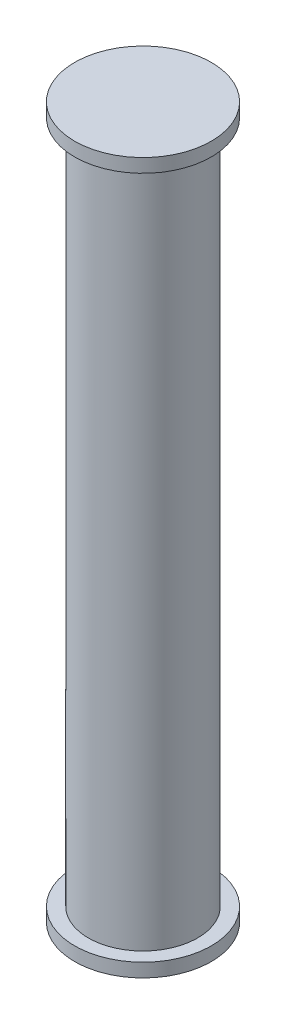
ISO-10303-21;
HEADER;
FILE_DESCRIPTION(('STEP AP214'),'2;1');
FILE_NAME('part.step','',(''),(''),'','','');
FILE_SCHEMA(('AUTOMOTIVE_DESIGN { 1 0 10303 214 1 1 1 1 }'));
ENDSEC;
DATA;
#1=APPLICATION_CONTEXT('core data for automotive mechanical design processes');
#2=APPLICATION_PROTOCOL_DEFINITION('international standard','automotive_design',2000,#1);
#3=PRODUCT_CONTEXT('',#1,'mechanical');
#4=PRODUCT('Part','Part','',(#3));
#5=PRODUCT_RELATED_PRODUCT_CATEGORY('part','',(#4));
#6=PRODUCT_DEFINITION_FORMATION('','',#4);
#7=PRODUCT_DEFINITION_CONTEXT('part definition',#1,'design');
#8=PRODUCT_DEFINITION('design','',#6,#7);
#9=PRODUCT_DEFINITION_SHAPE('','',#8);
#10=(LENGTH_UNIT() NAMED_UNIT(*) SI_UNIT(.MILLI.,.METRE.));
#11=(NAMED_UNIT(*) PLANE_ANGLE_UNIT() SI_UNIT($,.RADIAN.));
#12=(NAMED_UNIT(*) SI_UNIT($,.STERADIAN.) SOLID_ANGLE_UNIT());
#13=UNCERTAINTY_MEASURE_WITH_UNIT(LENGTH_MEASURE(1.E-05),#10,'distance_accuracy_value','');
#14=(GEOMETRIC_REPRESENTATION_CONTEXT(3) GLOBAL_UNCERTAINTY_ASSIGNED_CONTEXT((#13)) GLOBAL_UNIT_ASSIGNED_CONTEXT((#10,
#11,#12)) REPRESENTATION_CONTEXT('',''));
#15=CARTESIAN_POINT('',(0.,0.,0.));
#16=DIRECTION('',(0.,0.,1.));
#17=DIRECTION('',(1.,0.,0.));
#18=AXIS2_PLACEMENT_3D('',#15,#16,#17);
#19=CARTESIAN_POINT('',(0.,66.04,0.));
#20=DIRECTION('',(0.,-1.,0.));
#21=DIRECTION('',(0.,0.,-1.));
#22=AXIS2_PLACEMENT_3D('',#19,#20,#21);
#23=CYLINDRICAL_SURFACE('',#22,10.16);
#24=CARTESIAN_POINT('',(0.,63.5,0.));
#25=DIRECTION('',(0.,1.,0.));
#26=DIRECTION('',(0.,0.,1.));
#27=AXIS2_PLACEMENT_3D('',#24,#25,#26);
#28=CIRCLE('',#27,10.16);
#29=CARTESIAN_POINT('',(0.,63.5,10.16));
#30=VERTEX_POINT('',#29);
#31=EDGE_CURVE('E42',#30,#30,#28,.T.);
#32=ORIENTED_EDGE('',*,*,#31,.F.);
#33=EDGE_LOOP('',(#32));
#34=FACE_BOUND('',#33,.T.);
#35=CARTESIAN_POINT('',(0.,-63.5,0.));
#36=DIRECTION('',(0.,-1.,0.));
#37=DIRECTION('',(0.,0.,-1.));
#38=AXIS2_PLACEMENT_3D('',#35,#36,#37);
#39=CIRCLE('',#38,10.16);
#40=CARTESIAN_POINT('',(0.,-63.5,-10.16));
#41=VERTEX_POINT('',#40);
#42=EDGE_CURVE('E10',#41,#41,#39,.T.);
#43=ORIENTED_EDGE('',*,*,#42,.F.);
#44=EDGE_LOOP('',(#43));
#45=FACE_BOUND('',#44,.T.);
#46=ADVANCED_FACE('F36',(#34,#45),#23,.T.);
#47=CARTESIAN_POINT('',(0.,63.5,0.));
#48=DIRECTION('',(0.,1.,0.));
#49=DIRECTION('',(0.,0.,1.));
#50=AXIS2_PLACEMENT_3D('',#47,#48,#49);
#51=CYLINDRICAL_SURFACE('',#50,12.7);
#52=CARTESIAN_POINT('',(0.,63.5,0.));
#53=DIRECTION('',(0.,1.,0.));
#54=DIRECTION('',(0.,0.,1.));
#55=AXIS2_PLACEMENT_3D('',#52,#53,#54);
#56=CIRCLE('',#55,12.7);
#57=CARTESIAN_POINT('',(0.,63.5,12.7));
#58=VERTEX_POINT('',#57);
#59=EDGE_CURVE('E46',#58,#58,#56,.T.);
#60=ORIENTED_EDGE('',*,*,#59,.T.);
#61=EDGE_LOOP('',(#60));
#62=FACE_BOUND('',#61,.T.);
#63=CARTESIAN_POINT('',(0.,66.04,0.));
#64=DIRECTION('',(0.,1.,0.));
#65=DIRECTION('',(0.,0.,1.));
#66=AXIS2_PLACEMENT_3D('',#63,#64,#65);
#67=CIRCLE('',#66,12.7);
#68=CARTESIAN_POINT('',(0.,66.04,12.7));
#69=VERTEX_POINT('',#68);
#70=EDGE_CURVE('E50',#69,#69,#67,.T.);
#71=ORIENTED_EDGE('',*,*,#70,.F.);
#72=EDGE_LOOP('',(#71));
#73=FACE_BOUND('',#72,.T.);
#74=ADVANCED_FACE('F77',(#62,#73),#51,.T.);
#75=CARTESIAN_POINT('',(0.,63.5,0.));
#76=DIRECTION('',(0.,1.,0.));
#77=DIRECTION('',(0.,0.,1.));
#78=AXIS2_PLACEMENT_3D('',#75,#76,#77);
#79=PLANE('',#78);
#80=ORIENTED_EDGE('',*,*,#31,.T.);
#81=EDGE_LOOP('',(#80));
#82=FACE_BOUND('',#81,.T.);
#83=ORIENTED_EDGE('',*,*,#59,.F.);
#84=EDGE_LOOP('',(#83));
#85=FACE_BOUND('',#84,.T.);
#86=ADVANCED_FACE('F82',(#82,#85),#79,.F.);
#87=CARTESIAN_POINT('',(0.,66.04,0.));
#88=DIRECTION('',(0.,1.,0.));
#89=DIRECTION('',(0.,0.,1.));
#90=AXIS2_PLACEMENT_3D('',#87,#88,#89);
#91=PLANE('',#90);
#92=ORIENTED_EDGE('',*,*,#70,.T.);
#93=EDGE_LOOP('',(#92));
#94=FACE_BOUND('',#93,.T.);
#95=ADVANCED_FACE('F74',(#94),#91,.T.);
#96=CARTESIAN_POINT('',(0.,-63.5,0.));
#97=DIRECTION('',(0.,-1.,0.));
#98=DIRECTION('',(0.,0.,-1.));
#99=AXIS2_PLACEMENT_3D('',#96,#97,#98);
#100=CYLINDRICAL_SURFACE('',#99,12.7);
#101=CARTESIAN_POINT('',(0.,-63.5,0.));
#102=DIRECTION('',(0.,-1.,0.));
#103=DIRECTION('',(0.,0.,-1.));
#104=AXIS2_PLACEMENT_3D('',#101,#102,#103);
#105=CIRCLE('',#104,12.7);
#106=CARTESIAN_POINT('',(0.,-63.5,-12.7));
#107=VERTEX_POINT('',#106);
#108=EDGE_CURVE('E54',#107,#107,#105,.T.);
#109=ORIENTED_EDGE('',*,*,#108,.T.);
#110=EDGE_LOOP('',(#109));
#111=FACE_BOUND('',#110,.T.);
#112=CARTESIAN_POINT('',(0.,-66.04,0.));
#113=DIRECTION('',(0.,-1.,0.));
#114=DIRECTION('',(0.,0.,-1.));
#115=AXIS2_PLACEMENT_3D('',#112,#113,#114);
#116=CIRCLE('',#115,12.7);
#117=CARTESIAN_POINT('',(0.,-66.04,-12.7));
#118=VERTEX_POINT('',#117);
#119=EDGE_CURVE('E56',#118,#118,#116,.T.);
#120=ORIENTED_EDGE('',*,*,#119,.F.);
#121=EDGE_LOOP('',(#120));
#122=FACE_BOUND('',#121,.T.);
#123=ADVANCED_FACE('F62',(#111,#122),#100,.T.);
#124=CARTESIAN_POINT('',(0.,-63.5,0.));
#125=DIRECTION('',(0.,-1.,0.));
#126=DIRECTION('',(0.,0.,-1.));
#127=AXIS2_PLACEMENT_3D('',#124,#125,#126);
#128=PLANE('',#127);
#129=ORIENTED_EDGE('',*,*,#42,.T.);
#130=EDGE_LOOP('',(#129));
#131=FACE_BOUND('',#130,.T.);
#132=ORIENTED_EDGE('',*,*,#108,.F.);
#133=EDGE_LOOP('',(#132));
#134=FACE_BOUND('',#133,.T.);
#135=ADVANCED_FACE('F65',(#131,#134),#128,.F.);
#136=CARTESIAN_POINT('',(0.,-66.04,0.));
#137=DIRECTION('',(0.,1.,0.));
#138=DIRECTION('',(0.,0.,1.));
#139=AXIS2_PLACEMENT_3D('',#136,#137,#138);
#140=PLANE('',#139);
#141=ORIENTED_EDGE('',*,*,#119,.T.);
#142=EDGE_LOOP('',(#141));
#143=FACE_BOUND('',#142,.T.);
#144=ADVANCED_FACE('F67',(#143),#140,.F.);
#145=CLOSED_SHELL('',(#46,#74,#86,#95,#123,#135,#144));
#146=MANIFOLD_SOLID_BREP('B2',#145);
#147=ADVANCED_BREP_SHAPE_REPRESENTATION('',(#18,#146),#14);
#148=SHAPE_DEFINITION_REPRESENTATION(#9,#147);
ENDSEC;
END-ISO-10303-21;
